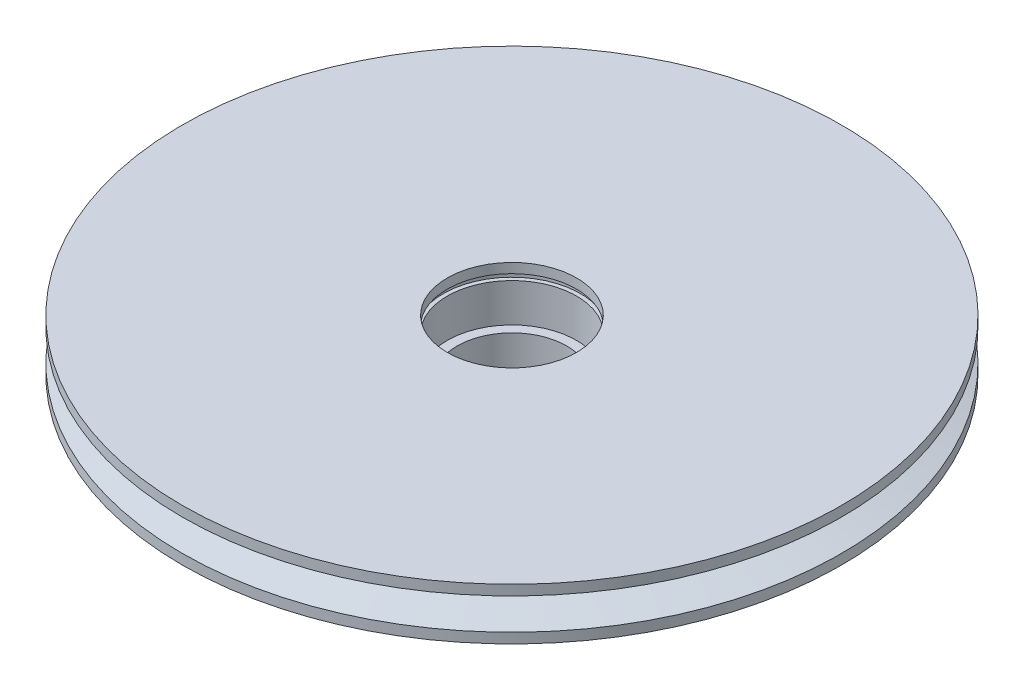
ISO-10303-21;
HEADER;
FILE_DESCRIPTION(('STEP AP214'),'2;1');
FILE_NAME('part.step','',(''),(''),'','','');
FILE_SCHEMA(('AUTOMOTIVE_DESIGN { 1 0 10303 214 1 1 1 1 }'));
ENDSEC;
DATA;
#1=APPLICATION_CONTEXT('core data for automotive mechanical design processes');
#2=APPLICATION_PROTOCOL_DEFINITION('international standard','automotive_design',2000,#1);
#3=PRODUCT_CONTEXT('',#1,'mechanical');
#4=PRODUCT('Part','Part','',(#3));
#5=PRODUCT_RELATED_PRODUCT_CATEGORY('part','',(#4));
#6=PRODUCT_DEFINITION_FORMATION('','',#4);
#7=PRODUCT_DEFINITION_CONTEXT('part definition',#1,'design');
#8=PRODUCT_DEFINITION('design','',#6,#7);
#9=PRODUCT_DEFINITION_SHAPE('','',#8);
#10=(LENGTH_UNIT() NAMED_UNIT(*) SI_UNIT(.MILLI.,.METRE.));
#11=(NAMED_UNIT(*) PLANE_ANGLE_UNIT() SI_UNIT($,.RADIAN.));
#12=(NAMED_UNIT(*) SI_UNIT($,.STERADIAN.) SOLID_ANGLE_UNIT());
#13=UNCERTAINTY_MEASURE_WITH_UNIT(LENGTH_MEASURE(1.E-05),#10,'distance_accuracy_value','');
#14=(GEOMETRIC_REPRESENTATION_CONTEXT(3) GLOBAL_UNCERTAINTY_ASSIGNED_CONTEXT((#13)) GLOBAL_UNIT_ASSIGNED_CONTEXT((#10,
#11,#12)) REPRESENTATION_CONTEXT('',''));
#15=CARTESIAN_POINT('',(0.,0.,0.));
#16=DIRECTION('',(0.,0.,1.));
#17=DIRECTION('',(1.,0.,0.));
#18=AXIS2_PLACEMENT_3D('',#15,#16,#17);
#19=CARTESIAN_POINT('',(0.,42.1053222546808,0.));
#20=DIRECTION('',(0.,1.,0.));
#21=DIRECTION('',(0.,0.,1.));
#22=AXIS2_PLACEMENT_3D('',#19,#20,#21);
#23=CYLINDRICAL_SURFACE('',#22,28.5);
#24=CARTESIAN_POINT('',(0.,9.49842386687209,0.));
#25=DIRECTION('',(0.,1.,0.));
#26=DIRECTION('',(0.,0.,1.));
#27=AXIS2_PLACEMENT_3D('',#24,#25,#26);
#28=CIRCLE('',#27,28.5);
#29=CARTESIAN_POINT('',(0.,9.49842386687209,28.5));
#30=VERTEX_POINT('',#29);
#31=EDGE_CURVE('E10',#30,#30,#28,.T.);
#32=ORIENTED_EDGE('',*,*,#31,.F.);
#33=EDGE_LOOP('',(#32));
#34=FACE_BOUND('',#33,.T.);
#35=CARTESIAN_POINT('',(0.,6.50157613312789,0.));
#36=DIRECTION('',(0.,1.,0.));
#37=DIRECTION('',(0.,0.,1.));
#38=AXIS2_PLACEMENT_3D('',#35,#36,#37);
#39=CIRCLE('',#38,28.5);
#40=CARTESIAN_POINT('',(0.,6.50157613312789,28.5));
#41=VERTEX_POINT('',#40);
#42=EDGE_CURVE('E127',#41,#41,#39,.T.);
#43=ORIENTED_EDGE('',*,*,#42,.T.);
#44=EDGE_LOOP('',(#43));
#45=FACE_BOUND('',#44,.T.);
#46=ADVANCED_FACE('F33',(#34,#45),#23,.T.);
#47=CARTESIAN_POINT('',(0.,9.49842386687209,0.));
#48=DIRECTION('',(0.,1.,0.));
#49=DIRECTION('',(0.,0.,1.));
#50=AXIS2_PLACEMENT_3D('',#47,#48,#49);
#51=CONICAL_SURFACE('',#50,28.5,1.27409035395586);
#52=CARTESIAN_POINT('',(0.,12.8614613629173,0.));
#53=DIRECTION('',(0.,1.,0.));
#54=DIRECTION('',(0.,0.,1.));
#55=AXIS2_PLACEMENT_3D('',#52,#53,#54);
#56=CIRCLE('',#55,39.5);
#57=CARTESIAN_POINT('',(0.,12.8614613629173,39.5));
#58=VERTEX_POINT('',#57);
#59=EDGE_CURVE('E39',#58,#58,#56,.T.);
#60=ORIENTED_EDGE('',*,*,#59,.F.);
#61=EDGE_LOOP('',(#60));
#62=FACE_BOUND('',#61,.T.);
#63=ORIENTED_EDGE('',*,*,#31,.T.);
#64=EDGE_LOOP('',(#63));
#65=FACE_BOUND('',#64,.T.);
#66=ADVANCED_FACE('F296',(#62,#65),#51,.T.);
#67=CARTESIAN_POINT('',(0.,42.1053222546808,0.));
#68=DIRECTION('',(0.,1.,0.));
#69=DIRECTION('',(0.,0.,1.));
#70=AXIS2_PLACEMENT_3D('',#67,#68,#69);
#71=CYLINDRICAL_SURFACE('',#70,39.5);
#72=CARTESIAN_POINT('',(0.,15.1385386370827,0.));
#73=DIRECTION('',(0.,1.,0.));
#74=DIRECTION('',(0.,0.,1.));
#75=AXIS2_PLACEMENT_3D('',#72,#73,#74);
#76=CIRCLE('',#75,39.5);
#77=CARTESIAN_POINT('',(0.,15.1385386370827,39.5));
#78=VERTEX_POINT('',#77);
#79=EDGE_CURVE('E43',#78,#78,#76,.T.);
#80=ORIENTED_EDGE('',*,*,#79,.F.);
#81=EDGE_LOOP('',(#80));
#82=FACE_BOUND('',#81,.T.);
#83=ORIENTED_EDGE('',*,*,#59,.T.);
#84=EDGE_LOOP('',(#83));
#85=FACE_BOUND('',#84,.T.);
#86=ADVANCED_FACE('F291',(#82,#85),#71,.T.);
#87=CARTESIAN_POINT('',(0.,15.1385386370827,0.));
#88=DIRECTION('',(0.,-1.,0.));
#89=DIRECTION('',(0.,0.,-1.));
#90=AXIS2_PLACEMENT_3D('',#87,#88,#89);
#91=CONICAL_SURFACE('',#90,39.5,1.27409035395586);
#92=CARTESIAN_POINT('',(0.,18.5015761331279,0.));
#93=DIRECTION('',(0.,1.,0.));
#94=DIRECTION('',(0.,0.,1.));
#95=AXIS2_PLACEMENT_3D('',#92,#93,#94);
#96=CIRCLE('',#95,28.5);
#97=CARTESIAN_POINT('',(0.,18.5015761331279,28.5));
#98=VERTEX_POINT('',#97);
#99=EDGE_CURVE('E47',#98,#98,#96,.T.);
#100=ORIENTED_EDGE('',*,*,#99,.F.);
#101=EDGE_LOOP('',(#100));
#102=FACE_BOUND('',#101,.T.);
#103=ORIENTED_EDGE('',*,*,#79,.T.);
#104=EDGE_LOOP('',(#103));
#105=FACE_BOUND('',#104,.T.);
#106=ADVANCED_FACE('F285',(#102,#105),#91,.T.);
#107=CARTESIAN_POINT('',(0.,42.1053222546808,0.));
#108=DIRECTION('',(0.,1.,0.));
#109=DIRECTION('',(0.,0.,1.));
#110=AXIS2_PLACEMENT_3D('',#107,#108,#109);
#111=CYLINDRICAL_SURFACE('',#110,28.5);
#112=CARTESIAN_POINT('',(0.,21.4984238668721,0.));
#113=DIRECTION('',(0.,1.,0.));
#114=DIRECTION('',(0.,0.,1.));
#115=AXIS2_PLACEMENT_3D('',#112,#113,#114);
#116=CIRCLE('',#115,28.5);
#117=CARTESIAN_POINT('',(0.,21.4984238668721,28.5));
#118=VERTEX_POINT('',#117);
#119=EDGE_CURVE('E52',#118,#118,#116,.T.);
#120=ORIENTED_EDGE('',*,*,#119,.F.);
#121=EDGE_LOOP('',(#120));
#122=FACE_BOUND('',#121,.T.);
#123=ORIENTED_EDGE('',*,*,#99,.T.);
#124=EDGE_LOOP('',(#123));
#125=FACE_BOUND('',#124,.T.);
#126=ADVANCED_FACE('F279',(#122,#125),#111,.T.);
#127=CARTESIAN_POINT('',(0.,21.4984238668721,0.));
#128=DIRECTION('',(0.,1.,0.));
#129=DIRECTION('',(0.,0.,1.));
#130=AXIS2_PLACEMENT_3D('',#127,#128,#129);
#131=CONICAL_SURFACE('',#130,28.5,1.27409035395586);
#132=CARTESIAN_POINT('',(0.,24.8614613629173,0.));
#133=DIRECTION('',(0.,1.,0.));
#134=DIRECTION('',(0.,0.,1.));
#135=AXIS2_PLACEMENT_3D('',#132,#133,#134);
#136=CIRCLE('',#135,39.5);
#137=CARTESIAN_POINT('',(0.,24.8614613629173,39.5));
#138=VERTEX_POINT('',#137);
#139=EDGE_CURVE('E55',#138,#138,#136,.T.);
#140=ORIENTED_EDGE('',*,*,#139,.F.);
#141=EDGE_LOOP('',(#140));
#142=FACE_BOUND('',#141,.T.);
#143=ORIENTED_EDGE('',*,*,#119,.T.);
#144=EDGE_LOOP('',(#143));
#145=FACE_BOUND('',#144,.T.);
#146=ADVANCED_FACE('F273',(#142,#145),#131,.T.);
#147=CARTESIAN_POINT('',(0.,42.1053222546808,0.));
#148=DIRECTION('',(0.,1.,0.));
#149=DIRECTION('',(0.,0.,1.));
#150=AXIS2_PLACEMENT_3D('',#147,#148,#149);
#151=CYLINDRICAL_SURFACE('',#150,39.5);
#152=CARTESIAN_POINT('',(0.,30.8614613629173,0.));
#153=DIRECTION('',(0.,1.,0.));
#154=DIRECTION('',(0.,0.,1.));
#155=AXIS2_PLACEMENT_3D('',#152,#153,#154);
#156=CIRCLE('',#155,39.5);
#157=CARTESIAN_POINT('',(0.,30.8614613629173,39.5));
#158=VERTEX_POINT('',#157);
#159=EDGE_CURVE('E58',#158,#158,#156,.T.);
#160=ORIENTED_EDGE('',*,*,#159,.F.);
#161=EDGE_LOOP('',(#160));
#162=FACE_BOUND('',#161,.T.);
#163=ORIENTED_EDGE('',*,*,#139,.T.);
#164=EDGE_LOOP('',(#163));
#165=FACE_BOUND('',#164,.T.);
#166=ADVANCED_FACE('F267',(#162,#165),#151,.T.);
#167=CARTESIAN_POINT('',(102.,30.8614613629173,0.));
#168=DIRECTION('',(0.,1.,0.));
#169=DIRECTION('',(0.,0.,1.));
#170=AXIS2_PLACEMENT_3D('',#167,#168,#169);
#171=PLANE('',#170);
#172=CARTESIAN_POINT('',(0.,30.8614613629173,0.));
#173=DIRECTION('',(0.,1.,0.));
#174=DIRECTION('',(0.,0.,1.));
#175=AXIS2_PLACEMENT_3D('',#172,#173,#174);
#176=CIRCLE('',#175,102.);
#177=CARTESIAN_POINT('',(0.,30.8614613629173,102.));
#178=VERTEX_POINT('',#177);
#179=EDGE_CURVE('E61',#178,#178,#176,.T.);
#180=ORIENTED_EDGE('',*,*,#179,.F.);
#181=EDGE_LOOP('',(#180));
#182=FACE_BOUND('',#181,.T.);
#183=ORIENTED_EDGE('',*,*,#159,.T.);
#184=EDGE_LOOP('',(#183));
#185=FACE_BOUND('',#184,.T.);
#186=ADVANCED_FACE('F261',(#182,#185),#171,.F.);
#187=CARTESIAN_POINT('',(0.,42.1053222546808,0.));
#188=DIRECTION('',(0.,1.,0.));
#189=DIRECTION('',(0.,0.,1.));
#190=AXIS2_PLACEMENT_3D('',#187,#188,#189);
#191=CYLINDRICAL_SURFACE('',#190,102.);
#192=CARTESIAN_POINT('',(0.,34.,0.));
#193=DIRECTION('',(0.,1.,0.));
#194=DIRECTION('',(0.,0.,1.));
#195=AXIS2_PLACEMENT_3D('',#192,#193,#194);
#196=CIRCLE('',#195,102.);
#197=CARTESIAN_POINT('',(0.,34.,102.));
#198=VERTEX_POINT('',#197);
#199=EDGE_CURVE('E64',#198,#198,#196,.T.);
#200=ORIENTED_EDGE('',*,*,#199,.F.);
#201=EDGE_LOOP('',(#200));
#202=FACE_BOUND('',#201,.T.);
#203=ORIENTED_EDGE('',*,*,#179,.T.);
#204=EDGE_LOOP('',(#203));
#205=FACE_BOUND('',#204,.T.);
#206=ADVANCED_FACE('F255',(#202,#205),#191,.T.);
#207=CARTESIAN_POINT('',(0.,34.,0.));
#208=DIRECTION('',(0.,-1.,0.));
#209=DIRECTION('',(0.,0.,-1.));
#210=AXIS2_PLACEMENT_3D('',#207,#208,#209);
#211=CONICAL_SURFACE('',#210,102.,1.27409035395586);
#212=CARTESIAN_POINT('',(0.,37.3630374960452,0.));
#213=DIRECTION('',(0.,1.,0.));
#214=DIRECTION('',(0.,0.,1.));
#215=AXIS2_PLACEMENT_3D('',#212,#213,#214);
#216=CIRCLE('',#215,91.);
#217=CARTESIAN_POINT('',(0.,37.3630374960452,91.));
#218=VERTEX_POINT('',#217);
#219=EDGE_CURVE('E67',#218,#218,#216,.T.);
#220=ORIENTED_EDGE('',*,*,#219,.F.);
#221=EDGE_LOOP('',(#220));
#222=FACE_BOUND('',#221,.T.);
#223=ORIENTED_EDGE('',*,*,#199,.T.);
#224=EDGE_LOOP('',(#223));
#225=FACE_BOUND('',#224,.T.);
#226=ADVANCED_FACE('F249',(#222,#225),#211,.T.);
#227=CARTESIAN_POINT('',(0.,42.1053222546808,0.));
#228=DIRECTION('',(0.,1.,0.));
#229=DIRECTION('',(0.,0.,1.));
#230=AXIS2_PLACEMENT_3D('',#227,#228,#229);
#231=CYLINDRICAL_SURFACE('',#230,91.);
#232=CARTESIAN_POINT('',(0.,40.3598852297894,0.));
#233=DIRECTION('',(0.,1.,0.));
#234=DIRECTION('',(0.,0.,1.));
#235=AXIS2_PLACEMENT_3D('',#232,#233,#234);
#236=CIRCLE('',#235,91.);
#237=CARTESIAN_POINT('',(0.,40.3598852297894,91.));
#238=VERTEX_POINT('',#237);
#239=EDGE_CURVE('E70',#238,#238,#236,.T.);
#240=ORIENTED_EDGE('',*,*,#239,.F.);
#241=EDGE_LOOP('',(#240));
#242=FACE_BOUND('',#241,.T.);
#243=ORIENTED_EDGE('',*,*,#219,.T.);
#244=EDGE_LOOP('',(#243));
#245=FACE_BOUND('',#244,.T.);
#246=ADVANCED_FACE('F243',(#242,#245),#231,.T.);
#247=CARTESIAN_POINT('',(0.,40.3598852297894,0.));
#248=DIRECTION('',(0.,1.,0.));
#249=DIRECTION('',(0.,0.,1.));
#250=AXIS2_PLACEMENT_3D('',#247,#248,#249);
#251=CONICAL_SURFACE('',#250,91.,1.27409035395586);
#252=CARTESIAN_POINT('',(0.,43.7229227258346,0.));
#253=DIRECTION('',(0.,1.,0.));
#254=DIRECTION('',(0.,0.,1.));
#255=AXIS2_PLACEMENT_3D('',#252,#253,#254);
#256=CIRCLE('',#255,102.);
#257=CARTESIAN_POINT('',(0.,43.7229227258346,102.));
#258=VERTEX_POINT('',#257);
#259=EDGE_CURVE('E73',#258,#258,#256,.T.);
#260=ORIENTED_EDGE('',*,*,#259,.F.);
#261=EDGE_LOOP('',(#260));
#262=FACE_BOUND('',#261,.T.);
#263=ORIENTED_EDGE('',*,*,#239,.T.);
#264=EDGE_LOOP('',(#263));
#265=FACE_BOUND('',#264,.T.);
#266=ADVANCED_FACE('F237',(#262,#265),#251,.T.);
#267=CARTESIAN_POINT('',(0.,42.1053222546808,0.));
#268=DIRECTION('',(0.,1.,0.));
#269=DIRECTION('',(0.,0.,1.));
#270=AXIS2_PLACEMENT_3D('',#267,#268,#269);
#271=CYLINDRICAL_SURFACE('',#270,102.);
#272=CARTESIAN_POINT('',(0.,46.8614613629173,0.));
#273=DIRECTION('',(0.,1.,0.));
#274=DIRECTION('',(0.,0.,1.));
#275=AXIS2_PLACEMENT_3D('',#272,#273,#274);
#276=CIRCLE('',#275,102.);
#277=CARTESIAN_POINT('',(0.,46.8614613629173,102.));
#278=VERTEX_POINT('',#277);
#279=EDGE_CURVE('E76',#278,#278,#276,.T.);
#280=ORIENTED_EDGE('',*,*,#279,.F.);
#281=EDGE_LOOP('',(#280));
#282=FACE_BOUND('',#281,.T.);
#283=ORIENTED_EDGE('',*,*,#259,.T.);
#284=EDGE_LOOP('',(#283));
#285=FACE_BOUND('',#284,.T.);
#286=ADVANCED_FACE('F231',(#282,#285),#271,.T.);
#287=CARTESIAN_POINT('',(102.,46.8614613629173,0.));
#288=DIRECTION('',(0.,-1.,0.));
#289=DIRECTION('',(0.,0.,-1.));
#290=AXIS2_PLACEMENT_3D('',#287,#288,#289);
#291=PLANE('',#290);
#292=CARTESIAN_POINT('',(0.,46.8614613629173,0.));
#293=DIRECTION('',(0.,1.,0.));
#294=DIRECTION('',(0.,0.,1.));
#295=AXIS2_PLACEMENT_3D('',#292,#293,#294);
#296=CIRCLE('',#295,20.);
#297=CARTESIAN_POINT('',(0.,46.8614613629173,20.));
#298=VERTEX_POINT('',#297);
#299=EDGE_CURVE('E79',#298,#298,#296,.T.);
#300=ORIENTED_EDGE('',*,*,#299,.F.);
#301=EDGE_LOOP('',(#300));
#302=FACE_BOUND('',#301,.T.);
#303=ORIENTED_EDGE('',*,*,#279,.T.);
#304=EDGE_LOOP('',(#303));
#305=FACE_BOUND('',#304,.T.);
#306=ADVANCED_FACE('F225',(#302,#305),#291,.F.);
#307=CARTESIAN_POINT('',(0.,42.1053222546808,0.));
#308=DIRECTION('',(0.,1.,0.));
#309=DIRECTION('',(0.,0.,1.));
#310=AXIS2_PLACEMENT_3D('',#307,#308,#309);
#311=CYLINDRICAL_SURFACE('',#310,20.);
#312=CARTESIAN_POINT('',(0.,43.8614613629173,0.));
#313=DIRECTION('',(0.,1.,0.));
#314=DIRECTION('',(0.,0.,1.));
#315=AXIS2_PLACEMENT_3D('',#312,#313,#314);
#316=CIRCLE('',#315,20.);
#317=CARTESIAN_POINT('',(0.,43.8614613629173,20.));
#318=VERTEX_POINT('',#317);
#319=EDGE_CURVE('E82',#318,#318,#316,.T.);
#320=ORIENTED_EDGE('',*,*,#319,.F.);
#321=EDGE_LOOP('',(#320));
#322=FACE_BOUND('',#321,.T.);
#323=ORIENTED_EDGE('',*,*,#299,.T.);
#324=EDGE_LOOP('',(#323));
#325=FACE_BOUND('',#324,.T.);
#326=ADVANCED_FACE('F219',(#322,#325),#311,.F.);
#327=CARTESIAN_POINT('',(20.,43.8614613629173,0.));
#328=DIRECTION('',(0.,1.,0.));
#329=DIRECTION('',(0.,0.,1.));
#330=AXIS2_PLACEMENT_3D('',#327,#328,#329);
#331=PLANE('',#330);
#332=CARTESIAN_POINT('',(0.,43.8614613629173,0.));
#333=DIRECTION('',(0.,1.,0.));
#334=DIRECTION('',(0.,0.,1.));
#335=AXIS2_PLACEMENT_3D('',#332,#333,#334);
#336=CIRCLE('',#335,21.25);
#337=CARTESIAN_POINT('',(0.,43.8614613629173,21.25));
#338=VERTEX_POINT('',#337);
#339=EDGE_CURVE('E85',#338,#338,#336,.T.);
#340=ORIENTED_EDGE('',*,*,#339,.F.);
#341=EDGE_LOOP('',(#340));
#342=FACE_BOUND('',#341,.T.);
#343=ORIENTED_EDGE('',*,*,#319,.T.);
#344=EDGE_LOOP('',(#343));
#345=FACE_BOUND('',#344,.T.);
#346=ADVANCED_FACE('F213',(#342,#345),#331,.F.);
#347=CARTESIAN_POINT('',(0.,42.1053222546808,0.));
#348=DIRECTION('',(0.,1.,0.));
#349=DIRECTION('',(0.,0.,1.));
#350=AXIS2_PLACEMENT_3D('',#347,#348,#349);
#351=CYLINDRICAL_SURFACE('',#350,21.25);
#352=CARTESIAN_POINT('',(0.,42.0114613629173,0.));
#353=DIRECTION('',(0.,1.,0.));
#354=DIRECTION('',(0.,0.,1.));
#355=AXIS2_PLACEMENT_3D('',#352,#353,#354);
#356=CIRCLE('',#355,21.25);
#357=CARTESIAN_POINT('',(0.,42.0114613629173,21.25));
#358=VERTEX_POINT('',#357);
#359=EDGE_CURVE('E88',#358,#358,#356,.T.);
#360=ORIENTED_EDGE('',*,*,#359,.F.);
#361=EDGE_LOOP('',(#360));
#362=FACE_BOUND('',#361,.T.);
#363=ORIENTED_EDGE('',*,*,#339,.T.);
#364=EDGE_LOOP('',(#363));
#365=FACE_BOUND('',#364,.T.);
#366=ADVANCED_FACE('F207',(#362,#365),#351,.F.);
#367=CARTESIAN_POINT('',(21.25,42.0114613629173,0.));
#368=DIRECTION('',(0.,-1.,0.));
#369=DIRECTION('',(0.,0.,-1.));
#370=AXIS2_PLACEMENT_3D('',#367,#368,#369);
#371=PLANE('',#370);
#372=CARTESIAN_POINT('',(0.,42.0114613629173,0.));
#373=DIRECTION('',(0.,1.,0.));
#374=DIRECTION('',(0.,0.,1.));
#375=AXIS2_PLACEMENT_3D('',#372,#373,#374);
#376=CIRCLE('',#375,20.);
#377=CARTESIAN_POINT('',(0.,42.0114613629173,20.));
#378=VERTEX_POINT('',#377);
#379=EDGE_CURVE('E91',#378,#378,#376,.T.);
#380=ORIENTED_EDGE('',*,*,#379,.F.);
#381=EDGE_LOOP('',(#380));
#382=FACE_BOUND('',#381,.T.);
#383=ORIENTED_EDGE('',*,*,#359,.T.);
#384=EDGE_LOOP('',(#383));
#385=FACE_BOUND('',#384,.T.);
#386=ADVANCED_FACE('F201',(#382,#385),#371,.F.);
#387=CARTESIAN_POINT('',(0.,42.1053222546808,0.));
#388=DIRECTION('',(0.,1.,0.));
#389=DIRECTION('',(0.,0.,1.));
#390=AXIS2_PLACEMENT_3D('',#387,#388,#389);
#391=CYLINDRICAL_SURFACE('',#390,20.);
#392=CARTESIAN_POINT('',(0.,30.1114613629173,0.));
#393=DIRECTION('',(0.,1.,0.));
#394=DIRECTION('',(0.,0.,1.));
#395=AXIS2_PLACEMENT_3D('',#392,#393,#394);
#396=CIRCLE('',#395,20.);
#397=CARTESIAN_POINT('',(0.,30.1114613629173,20.));
#398=VERTEX_POINT('',#397);
#399=EDGE_CURVE('E94',#398,#398,#396,.T.);
#400=ORIENTED_EDGE('',*,*,#399,.F.);
#401=EDGE_LOOP('',(#400));
#402=FACE_BOUND('',#401,.T.);
#403=ORIENTED_EDGE('',*,*,#379,.T.);
#404=EDGE_LOOP('',(#403));
#405=FACE_BOUND('',#404,.T.);
#406=ADVANCED_FACE('F195',(#402,#405),#391,.F.);
#407=CARTESIAN_POINT('',(20.,30.1114613629173,0.));
#408=DIRECTION('',(0.,-1.,0.));
#409=DIRECTION('',(0.,0.,-1.));
#410=AXIS2_PLACEMENT_3D('',#407,#408,#409);
#411=PLANE('',#410);
#412=CARTESIAN_POINT('',(0.,30.1114613629173,0.));
#413=DIRECTION('',(0.,1.,0.));
#414=DIRECTION('',(0.,0.,1.));
#415=AXIS2_PLACEMENT_3D('',#412,#413,#414);
#416=CIRCLE('',#415,17.);
#417=CARTESIAN_POINT('',(0.,30.1114613629173,17.));
#418=VERTEX_POINT('',#417);
#419=EDGE_CURVE('E97',#418,#418,#416,.T.);
#420=ORIENTED_EDGE('',*,*,#419,.F.);
#421=EDGE_LOOP('',(#420));
#422=FACE_BOUND('',#421,.T.);
#423=ORIENTED_EDGE('',*,*,#399,.T.);
#424=EDGE_LOOP('',(#423));
#425=FACE_BOUND('',#424,.T.);
#426=ADVANCED_FACE('F189',(#422,#425),#411,.F.);
#427=CARTESIAN_POINT('',(0.,42.1053222546808,0.));
#428=DIRECTION('',(0.,1.,0.));
#429=DIRECTION('',(0.,0.,1.));
#430=AXIS2_PLACEMENT_3D('',#427,#428,#429);
#431=CYLINDRICAL_SURFACE('',#430,17.);
#432=CARTESIAN_POINT('',(0.,16.75,0.));
#433=DIRECTION('',(0.,1.,0.));
#434=DIRECTION('',(0.,0.,1.));
#435=AXIS2_PLACEMENT_3D('',#432,#433,#434);
#436=CIRCLE('',#435,17.);
#437=CARTESIAN_POINT('',(0.,16.75,17.));
#438=VERTEX_POINT('',#437);
#439=EDGE_CURVE('E100',#438,#438,#436,.T.);
#440=ORIENTED_EDGE('',*,*,#439,.F.);
#441=EDGE_LOOP('',(#440));
#442=FACE_BOUND('',#441,.T.);
#443=ORIENTED_EDGE('',*,*,#419,.T.);
#444=EDGE_LOOP('',(#443));
#445=FACE_BOUND('',#444,.T.);
#446=ADVANCED_FACE('F183',(#442,#445),#431,.F.);
#447=CARTESIAN_POINT('',(17.,16.75,0.));
#448=DIRECTION('',(0.,1.,0.));
#449=DIRECTION('',(0.,0.,1.));
#450=AXIS2_PLACEMENT_3D('',#447,#448,#449);
#451=PLANE('',#450);
#452=CARTESIAN_POINT('',(0.,16.75,0.));
#453=DIRECTION('',(0.,1.,0.));
#454=DIRECTION('',(0.,0.,1.));
#455=AXIS2_PLACEMENT_3D('',#452,#453,#454);
#456=CIRCLE('',#455,20.);
#457=CARTESIAN_POINT('',(0.,16.75,20.));
#458=VERTEX_POINT('',#457);
#459=EDGE_CURVE('E103',#458,#458,#456,.T.);
#460=ORIENTED_EDGE('',*,*,#459,.F.);
#461=EDGE_LOOP('',(#460));
#462=FACE_BOUND('',#461,.T.);
#463=ORIENTED_EDGE('',*,*,#439,.T.);
#464=EDGE_LOOP('',(#463));
#465=FACE_BOUND('',#464,.T.);
#466=ADVANCED_FACE('F177',(#462,#465),#451,.F.);
#467=CARTESIAN_POINT('',(0.,42.1053222546808,0.));
#468=DIRECTION('',(0.,1.,0.));
#469=DIRECTION('',(0.,0.,1.));
#470=AXIS2_PLACEMENT_3D('',#467,#468,#469);
#471=CYLINDRICAL_SURFACE('',#470,20.);
#472=CARTESIAN_POINT('',(0.,4.85,0.));
#473=DIRECTION('',(0.,1.,0.));
#474=DIRECTION('',(0.,0.,1.));
#475=AXIS2_PLACEMENT_3D('',#472,#473,#474);
#476=CIRCLE('',#475,20.);
#477=CARTESIAN_POINT('',(0.,4.85,20.));
#478=VERTEX_POINT('',#477);
#479=EDGE_CURVE('E106',#478,#478,#476,.T.);
#480=ORIENTED_EDGE('',*,*,#479,.F.);
#481=EDGE_LOOP('',(#480));
#482=FACE_BOUND('',#481,.T.);
#483=ORIENTED_EDGE('',*,*,#459,.T.);
#484=EDGE_LOOP('',(#483));
#485=FACE_BOUND('',#484,.T.);
#486=ADVANCED_FACE('F171',(#482,#485),#471,.F.);
#487=CARTESIAN_POINT('',(20.,4.85,0.));
#488=DIRECTION('',(0.,1.,0.));
#489=DIRECTION('',(0.,0.,1.));
#490=AXIS2_PLACEMENT_3D('',#487,#488,#489);
#491=PLANE('',#490);
#492=CARTESIAN_POINT('',(0.,4.85,0.));
#493=DIRECTION('',(0.,1.,0.));
#494=DIRECTION('',(0.,0.,1.));
#495=AXIS2_PLACEMENT_3D('',#492,#493,#494);
#496=CIRCLE('',#495,21.25);
#497=CARTESIAN_POINT('',(0.,4.85,21.25));
#498=VERTEX_POINT('',#497);
#499=EDGE_CURVE('E109',#498,#498,#496,.T.);
#500=ORIENTED_EDGE('',*,*,#499,.F.);
#501=EDGE_LOOP('',(#500));
#502=FACE_BOUND('',#501,.T.);
#503=ORIENTED_EDGE('',*,*,#479,.T.);
#504=EDGE_LOOP('',(#503));
#505=FACE_BOUND('',#504,.T.);
#506=ADVANCED_FACE('F165',(#502,#505),#491,.F.);
#507=CARTESIAN_POINT('',(0.,42.1053222546808,0.));
#508=DIRECTION('',(0.,1.,0.));
#509=DIRECTION('',(0.,0.,1.));
#510=AXIS2_PLACEMENT_3D('',#507,#508,#509);
#511=CYLINDRICAL_SURFACE('',#510,21.25);
#512=CARTESIAN_POINT('',(0.,3.,0.));
#513=DIRECTION('',(0.,1.,0.));
#514=DIRECTION('',(0.,0.,1.));
#515=AXIS2_PLACEMENT_3D('',#512,#513,#514);
#516=CIRCLE('',#515,21.25);
#517=CARTESIAN_POINT('',(0.,3.,21.25));
#518=VERTEX_POINT('',#517);
#519=EDGE_CURVE('E112',#518,#518,#516,.T.);
#520=ORIENTED_EDGE('',*,*,#519,.F.);
#521=EDGE_LOOP('',(#520));
#522=FACE_BOUND('',#521,.T.);
#523=ORIENTED_EDGE('',*,*,#499,.T.);
#524=EDGE_LOOP('',(#523));
#525=FACE_BOUND('',#524,.T.);
#526=ADVANCED_FACE('F159',(#522,#525),#511,.F.);
#527=CARTESIAN_POINT('',(21.25,3.,0.));
#528=DIRECTION('',(0.,-1.,0.));
#529=DIRECTION('',(0.,0.,-1.));
#530=AXIS2_PLACEMENT_3D('',#527,#528,#529);
#531=PLANE('',#530);
#532=CARTESIAN_POINT('',(0.,3.,0.));
#533=DIRECTION('',(0.,1.,0.));
#534=DIRECTION('',(0.,0.,1.));
#535=AXIS2_PLACEMENT_3D('',#532,#533,#534);
#536=CIRCLE('',#535,20.);
#537=CARTESIAN_POINT('',(0.,3.,20.));
#538=VERTEX_POINT('',#537);
#539=EDGE_CURVE('E115',#538,#538,#536,.T.);
#540=ORIENTED_EDGE('',*,*,#539,.F.);
#541=EDGE_LOOP('',(#540));
#542=FACE_BOUND('',#541,.T.);
#543=ORIENTED_EDGE('',*,*,#519,.T.);
#544=EDGE_LOOP('',(#543));
#545=FACE_BOUND('',#544,.T.);
#546=ADVANCED_FACE('F153',(#542,#545),#531,.F.);
#547=CARTESIAN_POINT('',(0.,42.1053222546808,0.));
#548=DIRECTION('',(0.,1.,0.));
#549=DIRECTION('',(0.,0.,1.));
#550=AXIS2_PLACEMENT_3D('',#547,#548,#549);
#551=CYLINDRICAL_SURFACE('',#550,20.);
#552=CARTESIAN_POINT('',(0.,0.,0.));
#553=DIRECTION('',(0.,1.,0.));
#554=DIRECTION('',(0.,0.,1.));
#555=AXIS2_PLACEMENT_3D('',#552,#553,#554);
#556=CIRCLE('',#555,20.);
#557=CARTESIAN_POINT('',(0.,0.,20.));
#558=VERTEX_POINT('',#557);
#559=EDGE_CURVE('E118',#558,#558,#556,.T.);
#560=ORIENTED_EDGE('',*,*,#559,.F.);
#561=EDGE_LOOP('',(#560));
#562=FACE_BOUND('',#561,.T.);
#563=ORIENTED_EDGE('',*,*,#539,.T.);
#564=EDGE_LOOP('',(#563));
#565=FACE_BOUND('',#564,.T.);
#566=ADVANCED_FACE('F147',(#562,#565),#551,.F.);
#567=CARTESIAN_POINT('',(20.,0.,0.));
#568=DIRECTION('',(0.,1.,0.));
#569=DIRECTION('',(0.,0.,1.));
#570=AXIS2_PLACEMENT_3D('',#567,#568,#569);
#571=PLANE('',#570);
#572=CARTESIAN_POINT('',(0.,0.,0.));
#573=DIRECTION('',(0.,1.,0.));
#574=DIRECTION('',(0.,0.,1.));
#575=AXIS2_PLACEMENT_3D('',#572,#573,#574);
#576=CIRCLE('',#575,39.5);
#577=CARTESIAN_POINT('',(0.,0.,39.5));
#578=VERTEX_POINT('',#577);
#579=EDGE_CURVE('E121',#578,#578,#576,.T.);
#580=ORIENTED_EDGE('',*,*,#579,.F.);
#581=EDGE_LOOP('',(#580));
#582=FACE_BOUND('',#581,.T.);
#583=ORIENTED_EDGE('',*,*,#559,.T.);
#584=EDGE_LOOP('',(#583));
#585=FACE_BOUND('',#584,.T.);
#586=ADVANCED_FACE('F141',(#582,#585),#571,.F.);
#587=CARTESIAN_POINT('',(0.,42.1053222546808,0.));
#588=DIRECTION('',(0.,1.,0.));
#589=DIRECTION('',(0.,0.,1.));
#590=AXIS2_PLACEMENT_3D('',#587,#588,#589);
#591=CYLINDRICAL_SURFACE('',#590,39.5);
#592=CARTESIAN_POINT('',(0.,3.13853863708267,0.));
#593=DIRECTION('',(0.,1.,0.));
#594=DIRECTION('',(0.,0.,1.));
#595=AXIS2_PLACEMENT_3D('',#592,#593,#594);
#596=CIRCLE('',#595,39.5);
#597=CARTESIAN_POINT('',(0.,3.13853863708267,39.5));
#598=VERTEX_POINT('',#597);
#599=EDGE_CURVE('E124',#598,#598,#596,.T.);
#600=ORIENTED_EDGE('',*,*,#599,.F.);
#601=EDGE_LOOP('',(#600));
#602=FACE_BOUND('',#601,.T.);
#603=ORIENTED_EDGE('',*,*,#579,.T.);
#604=EDGE_LOOP('',(#603));
#605=FACE_BOUND('',#604,.T.);
#606=ADVANCED_FACE('F135',(#602,#605),#591,.T.);
#607=CARTESIAN_POINT('',(0.,3.13853863708267,0.));
#608=DIRECTION('',(0.,-1.,0.));
#609=DIRECTION('',(0.,0.,-1.));
#610=AXIS2_PLACEMENT_3D('',#607,#608,#609);
#611=CONICAL_SURFACE('',#610,39.5,1.27409035395586);
#612=ORIENTED_EDGE('',*,*,#42,.F.);
#613=EDGE_LOOP('',(#612));
#614=FACE_BOUND('',#613,.T.);
#615=ORIENTED_EDGE('',*,*,#599,.T.);
#616=EDGE_LOOP('',(#615));
#617=FACE_BOUND('',#616,.T.);
#618=ADVANCED_FACE('F132',(#614,#617),#611,.T.);
#619=CLOSED_SHELL('',(#46,#66,#86,#106,#126,#146,#166,#186,#206,#226,#246,#266,#286,#306,#326,
#346,#366,#386,#406,#426,#446,#466,#486,#506,#526,#546,#566,#586,#606,#618));
#620=MANIFOLD_SOLID_BREP('B2',#619);
#621=ADVANCED_BREP_SHAPE_REPRESENTATION('',(#18,#620),#14);
#622=SHAPE_DEFINITION_REPRESENTATION(#9,#621);
ENDSEC;
END-ISO-10303-21;
